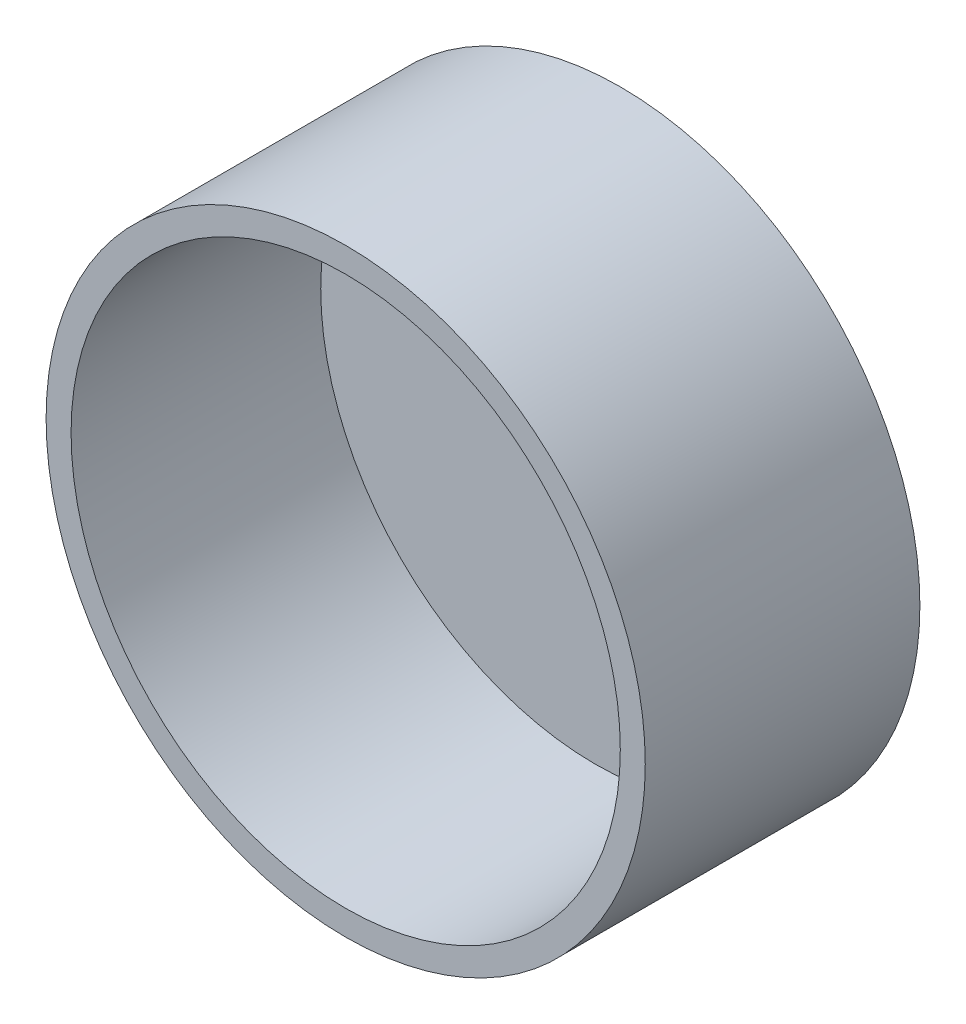
ISO-10303-21;
HEADER;
FILE_DESCRIPTION(('STEP AP214'),'2;1');
FILE_NAME('part.step','',(''),(''),'','','');
FILE_SCHEMA(('AUTOMOTIVE_DESIGN { 1 0 10303 214 1 1 1 1 }'));
ENDSEC;
DATA;
#1=APPLICATION_CONTEXT('core data for automotive mechanical design processes');
#2=APPLICATION_PROTOCOL_DEFINITION('international standard','automotive_design',2000,#1);
#3=PRODUCT_CONTEXT('',#1,'mechanical');
#4=PRODUCT('Part','Part','',(#3));
#5=PRODUCT_RELATED_PRODUCT_CATEGORY('part','',(#4));
#6=PRODUCT_DEFINITION_FORMATION('','',#4);
#7=PRODUCT_DEFINITION_CONTEXT('part definition',#1,'design');
#8=PRODUCT_DEFINITION('design','',#6,#7);
#9=PRODUCT_DEFINITION_SHAPE('','',#8);
#10=(LENGTH_UNIT() NAMED_UNIT(*) SI_UNIT(.MILLI.,.METRE.));
#11=(NAMED_UNIT(*) PLANE_ANGLE_UNIT() SI_UNIT($,.RADIAN.));
#12=(NAMED_UNIT(*) SI_UNIT($,.STERADIAN.) SOLID_ANGLE_UNIT());
#13=UNCERTAINTY_MEASURE_WITH_UNIT(LENGTH_MEASURE(1.E-05),#10,'distance_accuracy_value','');
#14=(GEOMETRIC_REPRESENTATION_CONTEXT(3) GLOBAL_UNCERTAINTY_ASSIGNED_CONTEXT((#13)) GLOBAL_UNIT_ASSIGNED_CONTEXT((#10,
#11,#12)) REPRESENTATION_CONTEXT('',''));
#15=CARTESIAN_POINT('',(0.,0.,0.));
#16=DIRECTION('',(0.,0.,1.));
#17=DIRECTION('',(1.,0.,0.));
#18=AXIS2_PLACEMENT_3D('',#15,#16,#17);
#19=CARTESIAN_POINT('',(0.,0.,25.4));
#20=DIRECTION('',(0.,0.,-1.));
#21=DIRECTION('',(-1.,0.,0.));
#22=AXIS2_PLACEMENT_3D('',#19,#20,#21);
#23=CYLINDRICAL_SURFACE('',#22,30.48);
#24=CARTESIAN_POINT('',(0.,0.,25.4));
#25=DIRECTION('',(0.,0.,1.));
#26=DIRECTION('',(1.,0.,0.));
#27=AXIS2_PLACEMENT_3D('',#24,#25,#26);
#28=CIRCLE('',#27,30.48);
#29=CARTESIAN_POINT('',(-30.48,0.,25.4));
#30=VERTEX_POINT('',#29);
#31=EDGE_CURVE('E10',#30,#30,#28,.T.);
#32=CARTESIAN_POINT('',(0.,0.,-2.54));
#33=DIRECTION('',(0.,0.,1.));
#34=DIRECTION('',(1.,0.,0.));
#35=AXIS2_PLACEMENT_3D('',#32,#33,#34);
#36=CIRCLE('',#35,30.48);
#37=CARTESIAN_POINT('',(-30.48,0.,-2.54));
#38=VERTEX_POINT('',#37);
#39=EDGE_CURVE('E45',#38,#38,#36,.T.);
#40=CARTESIAN_POINT('',(-30.48,0.,25.4));
#41=CARTESIAN_POINT('',(-30.48,0.,25.1089583333333));
#42=CARTESIAN_POINT('',(-30.48,0.,24.8179166666667));
#43=CARTESIAN_POINT('',(-30.48,0.,24.2358333333333));
#44=CARTESIAN_POINT('',(-30.48,0.,23.9447916666667));
#45=CARTESIAN_POINT('',(-30.48,0.,23.3627083333333));
#46=CARTESIAN_POINT('',(-30.48,0.,23.0716666666667));
#47=CARTESIAN_POINT('',(-30.48,0.,22.4895833333333));
#48=CARTESIAN_POINT('',(-30.48,0.,22.1985416666667));
#49=CARTESIAN_POINT('',(-30.48,0.,21.6164583333333));
#50=CARTESIAN_POINT('',(-30.48,0.,21.3254166666667));
#51=CARTESIAN_POINT('',(-30.48,0.,20.7433333333333));
#52=CARTESIAN_POINT('',(-30.48,0.,20.4522916666667));
#53=CARTESIAN_POINT('',(-30.48,0.,19.8702083333333));
#54=CARTESIAN_POINT('',(-30.48,0.,19.5791666666667));
#55=CARTESIAN_POINT('',(-30.48,0.,18.9970833333333));
#56=CARTESIAN_POINT('',(-30.48,0.,18.7060416666667));
#57=CARTESIAN_POINT('',(-30.48,0.,18.1239583333333));
#58=CARTESIAN_POINT('',(-30.48,0.,17.8329166666667));
#59=CARTESIAN_POINT('',(-30.48,0.,17.2508333333333));
#60=CARTESIAN_POINT('',(-30.48,0.,16.9597916666667));
#61=CARTESIAN_POINT('',(-30.48,0.,16.3777083333333));
#62=CARTESIAN_POINT('',(-30.48,0.,16.0866666666667));
#63=CARTESIAN_POINT('',(-30.48,0.,15.5045833333333));
#64=CARTESIAN_POINT('',(-30.48,0.,15.2135416666667));
#65=CARTESIAN_POINT('',(-30.48,0.,14.6314583333333));
#66=CARTESIAN_POINT('',(-30.48,0.,14.3404166666667));
#67=CARTESIAN_POINT('',(-30.48,0.,13.7583333333333));
#68=CARTESIAN_POINT('',(-30.48,0.,13.4672916666667));
#69=CARTESIAN_POINT('',(-30.48,0.,12.8852083333333));
#70=CARTESIAN_POINT('',(-30.48,0.,12.5941666666667));
#71=CARTESIAN_POINT('',(-30.48,0.,12.0120833333333));
#72=CARTESIAN_POINT('',(-30.48,0.,11.7210416666667));
#73=CARTESIAN_POINT('',(-30.48,0.,11.1389583333333));
#74=CARTESIAN_POINT('',(-30.48,0.,10.8479166666667));
#75=CARTESIAN_POINT('',(-30.48,0.,10.2658333333333));
#76=CARTESIAN_POINT('',(-30.48,0.,9.97479166666667));
#77=CARTESIAN_POINT('',(-30.48,0.,9.39270833333333));
#78=CARTESIAN_POINT('',(-30.48,0.,9.10166666666667));
#79=CARTESIAN_POINT('',(-30.48,0.,8.51958333333334));
#80=CARTESIAN_POINT('',(-30.48,0.,8.22854166666667));
#81=CARTESIAN_POINT('',(-30.48,0.,7.64645833333333));
#82=CARTESIAN_POINT('',(-30.48,0.,7.35541666666667));
#83=CARTESIAN_POINT('',(-30.48,0.,6.77333333333334));
#84=CARTESIAN_POINT('',(-30.48,0.,6.48229166666667));
#85=CARTESIAN_POINT('',(-30.48,0.,5.90020833333333));
#86=CARTESIAN_POINT('',(-30.48,0.,5.60916666666667));
#87=CARTESIAN_POINT('',(-30.48,0.,5.02708333333333));
#88=CARTESIAN_POINT('',(-30.48,0.,4.73604166666667));
#89=CARTESIAN_POINT('',(-30.48,0.,4.15395833333334));
#90=CARTESIAN_POINT('',(-30.48,0.,3.86291666666667));
#91=CARTESIAN_POINT('',(-30.48,0.,3.28083333333333));
#92=CARTESIAN_POINT('',(-30.48,0.,2.98979166666667));
#93=CARTESIAN_POINT('',(-30.48,0.,2.40770833333333));
#94=CARTESIAN_POINT('',(-30.48,0.,2.11666666666667));
#95=CARTESIAN_POINT('',(-30.48,0.,1.53458333333333));
#96=CARTESIAN_POINT('',(-30.48,0.,1.24354166666667));
#97=CARTESIAN_POINT('',(-30.48,0.,0.661458333333334));
#98=CARTESIAN_POINT('',(-30.48,0.,0.370416666666667));
#99=CARTESIAN_POINT('',(-30.48,0.,-0.211666666666667));
#100=CARTESIAN_POINT('',(-30.48,0.,-0.502708333333333));
#101=CARTESIAN_POINT('',(-30.48,0.,-1.08479166666667));
#102=CARTESIAN_POINT('',(-30.48,0.,-1.37583333333333));
#103=CARTESIAN_POINT('',(-30.48,0.,-1.95791666666667));
#104=CARTESIAN_POINT('',(-30.48,0.,-2.24895833333333));
#105=CARTESIAN_POINT('',(-30.48,0.,-2.54));
#106=B_SPLINE_CURVE_WITH_KNOTS('',3,(#40,#41,#42,#43,#44,#45,#46,#47,#48,#49,#50,#51,#52,#53,
#54,#55,#56,#57,#58,#59,#60,#61,#62,#63,#64,#65,#66,#67,#68,#69,#70,#71,#72,#73,#74,#75,#76,#77,
#78,#79,#80,#81,#82,#83,#84,#85,#86,#87,#88,#89,#90,#91,#92,#93,#94,#95,#96,#97,#98,#99,#100,
#101,#102,#103,#104,#105),.UNSPECIFIED.,.F.,.F.,(4,2,2,2,2,2,2,2,2,2,2,2,2,2,2,2,2,2,2,2,2,2,2,
2,2,2,2,2,2,2,2,2,4),(0.,0.873125000000002,1.74625,2.619375,3.4925,4.365625,5.23875,6.111875,
6.985,7.858125,8.73125,9.604375,10.4775,11.350625,12.22375,13.096875,13.97,14.843125,15.71625,
16.589375,17.4625,18.335625,19.20875,20.081875,20.955,21.828125,22.70125,23.574375,24.4475,
25.320625,26.19375,27.066875,27.94),.UNSPECIFIED.);
#107=EDGE_CURVE('BSEAM37',#30,#38,#106,.T.);
#108=ORIENTED_EDGE('',*,*,#31,.F.);
#109=ORIENTED_EDGE('',*,*,#39,.T.);
#110=ORIENTED_EDGE('',*,*,#107,.T.);
#111=ORIENTED_EDGE('',*,*,#107,.F.);
#112=EDGE_LOOP('',(#108,#110,#109,#111));
#113=FACE_BOUND('',#112,.T.);
#114=ADVANCED_FACE('F37',(#113),#23,.T.);
#115=CARTESIAN_POINT('',(0.,0.,25.4));
#116=DIRECTION('',(0.,0.,1.));
#117=DIRECTION('',(1.,0.,0.));
#118=AXIS2_PLACEMENT_3D('',#115,#116,#117);
#119=PLANE('',#118);
#120=CARTESIAN_POINT('',(0.,0.,25.4));
#121=DIRECTION('',(0.,0.,1.));
#122=DIRECTION('',(1.,0.,0.));
#123=AXIS2_PLACEMENT_3D('',#120,#121,#122);
#124=CIRCLE('',#123,27.94);
#125=CARTESIAN_POINT('',(-27.94,0.,25.4));
#126=VERTEX_POINT('',#125);
#127=EDGE_CURVE('E50',#126,#126,#124,.T.);
#128=ORIENTED_EDGE('',*,*,#127,.F.);
#129=EDGE_LOOP('',(#128));
#130=FACE_BOUND('',#129,.T.);
#131=ORIENTED_EDGE('',*,*,#31,.T.);
#132=EDGE_LOOP('',(#131));
#133=FACE_BOUND('',#132,.T.);
#134=ADVANCED_FACE('F73',(#130,#133),#119,.T.);
#135=CARTESIAN_POINT('',(0.,0.,-2.54));
#136=DIRECTION('',(0.,0.,1.));
#137=DIRECTION('',(1.,0.,0.));
#138=AXIS2_PLACEMENT_3D('',#135,#136,#137);
#139=PLANE('',#138);
#140=ORIENTED_EDGE('',*,*,#39,.F.);
#141=EDGE_LOOP('',(#140));
#142=FACE_BOUND('',#141,.T.);
#143=ADVANCED_FACE('F39',(#142),#139,.F.);
#144=CARTESIAN_POINT('',(0.,0.,25.4));
#145=DIRECTION('',(0.,0.,-1.));
#146=DIRECTION('',(-1.,0.,0.));
#147=AXIS2_PLACEMENT_3D('',#144,#145,#146);
#148=CYLINDRICAL_SURFACE('',#147,27.94);
#149=CARTESIAN_POINT('',(0.,0.,0.));
#150=DIRECTION('',(0.,0.,1.));
#151=DIRECTION('',(1.,0.,0.));
#152=AXIS2_PLACEMENT_3D('',#149,#150,#151);
#153=CIRCLE('',#152,27.94);
#154=CARTESIAN_POINT('',(-27.94,0.,0.));
#155=VERTEX_POINT('',#154);
#156=EDGE_CURVE('E55',#155,#155,#153,.T.);
#157=CARTESIAN_POINT('',(-27.94,0.,25.4));
#158=CARTESIAN_POINT('',(-27.94,0.,25.1354166666667));
#159=CARTESIAN_POINT('',(-27.94,0.,24.8708333333333));
#160=CARTESIAN_POINT('',(-27.94,0.,24.3416666666667));
#161=CARTESIAN_POINT('',(-27.94,0.,24.0770833333333));
#162=CARTESIAN_POINT('',(-27.94,0.,23.5479166666667));
#163=CARTESIAN_POINT('',(-27.94,0.,23.2833333333333));
#164=CARTESIAN_POINT('',(-27.94,0.,22.7541666666667));
#165=CARTESIAN_POINT('',(-27.94,0.,22.4895833333333));
#166=CARTESIAN_POINT('',(-27.94,0.,21.9604166666667));
#167=CARTESIAN_POINT('',(-27.94,0.,21.6958333333333));
#168=CARTESIAN_POINT('',(-27.94,0.,21.1666666666667));
#169=CARTESIAN_POINT('',(-27.94,0.,20.9020833333333));
#170=CARTESIAN_POINT('',(-27.94,0.,20.3729166666667));
#171=CARTESIAN_POINT('',(-27.94,0.,20.1083333333333));
#172=CARTESIAN_POINT('',(-27.94,0.,19.5791666666667));
#173=CARTESIAN_POINT('',(-27.94,0.,19.3145833333333));
#174=CARTESIAN_POINT('',(-27.94,0.,18.7854166666667));
#175=CARTESIAN_POINT('',(-27.94,0.,18.5208333333333));
#176=CARTESIAN_POINT('',(-27.94,0.,17.9916666666667));
#177=CARTESIAN_POINT('',(-27.94,0.,17.7270833333333));
#178=CARTESIAN_POINT('',(-27.94,0.,17.1979166666667));
#179=CARTESIAN_POINT('',(-27.94,0.,16.9333333333333));
#180=CARTESIAN_POINT('',(-27.94,0.,16.4041666666667));
#181=CARTESIAN_POINT('',(-27.94,0.,16.1395833333333));
#182=CARTESIAN_POINT('',(-27.94,0.,15.6104166666667));
#183=CARTESIAN_POINT('',(-27.94,0.,15.3458333333333));
#184=CARTESIAN_POINT('',(-27.94,0.,14.8166666666667));
#185=CARTESIAN_POINT('',(-27.94,0.,14.5520833333333));
#186=CARTESIAN_POINT('',(-27.94,0.,14.0229166666667));
#187=CARTESIAN_POINT('',(-27.94,0.,13.7583333333333));
#188=CARTESIAN_POINT('',(-27.94,0.,13.2291666666667));
#189=CARTESIAN_POINT('',(-27.94,0.,12.9645833333333));
#190=CARTESIAN_POINT('',(-27.94,0.,12.4354166666667));
#191=CARTESIAN_POINT('',(-27.94,0.,12.1708333333333));
#192=CARTESIAN_POINT('',(-27.94,0.,11.6416666666667));
#193=CARTESIAN_POINT('',(-27.94,0.,11.3770833333333));
#194=CARTESIAN_POINT('',(-27.94,0.,10.8479166666667));
#195=CARTESIAN_POINT('',(-27.94,0.,10.5833333333333));
#196=CARTESIAN_POINT('',(-27.94,0.,10.0541666666667));
#197=CARTESIAN_POINT('',(-27.94,0.,9.78958333333333));
#198=CARTESIAN_POINT('',(-27.94,0.,9.26041666666667));
#199=CARTESIAN_POINT('',(-27.94,0.,8.99583333333334));
#200=CARTESIAN_POINT('',(-27.94,0.,8.46666666666667));
#201=CARTESIAN_POINT('',(-27.94,0.,8.20208333333333));
#202=CARTESIAN_POINT('',(-27.94,0.,7.67291666666667));
#203=CARTESIAN_POINT('',(-27.94,0.,7.40833333333333));
#204=CARTESIAN_POINT('',(-27.94,0.,6.87916666666667));
#205=CARTESIAN_POINT('',(-27.94,0.,6.61458333333333));
#206=CARTESIAN_POINT('',(-27.94,0.,6.08541666666667));
#207=CARTESIAN_POINT('',(-27.94,0.,5.82083333333333));
#208=CARTESIAN_POINT('',(-27.94,0.,5.29166666666667));
#209=CARTESIAN_POINT('',(-27.94,0.,5.02708333333334));
#210=CARTESIAN_POINT('',(-27.94,0.,4.49791666666667));
#211=CARTESIAN_POINT('',(-27.94,0.,4.23333333333333));
#212=CARTESIAN_POINT('',(-27.94,0.,3.70416666666667));
#213=CARTESIAN_POINT('',(-27.94,0.,3.43958333333333));
#214=CARTESIAN_POINT('',(-27.94,0.,2.91041666666667));
#215=CARTESIAN_POINT('',(-27.94,0.,2.64583333333333));
#216=CARTESIAN_POINT('',(-27.94,0.,2.11666666666667));
#217=CARTESIAN_POINT('',(-27.94,0.,1.85208333333333));
#218=CARTESIAN_POINT('',(-27.94,0.,1.32291666666667));
#219=CARTESIAN_POINT('',(-27.94,0.,1.05833333333333));
#220=CARTESIAN_POINT('',(-27.94,0.,0.529166666666666));
#221=CARTESIAN_POINT('',(-27.94,0.,0.264583333333333));
#222=CARTESIAN_POINT('',(-27.94,0.,0.));
#223=B_SPLINE_CURVE_WITH_KNOTS('',3,(#157,#158,#159,#160,#161,#162,#163,#164,#165,#166,#167,
#168,#169,#170,#171,#172,#173,#174,#175,#176,#177,#178,#179,#180,#181,#182,#183,#184,#185,#186,
#187,#188,#189,#190,#191,#192,#193,#194,#195,#196,#197,#198,#199,#200,#201,#202,#203,#204,#205,
#206,#207,#208,#209,#210,#211,#212,#213,#214,#215,#216,#217,#218,#219,#220,#221,#222),
.UNSPECIFIED.,.F.,.F.,(4,2,2,2,2,2,2,2,2,2,2,2,2,2,2,2,2,2,2,2,2,2,2,2,2,2,2,2,2,2,2,2,4),(0.,
0.793750000000003,1.5875,2.38125,3.175,3.96875,4.7625,5.55625,6.35,7.14375,7.9375,8.73125,9.525,
10.31875,11.1125,11.90625,12.7,13.49375,14.2875,15.08125,15.875,16.66875,17.4625,18.25625,19.05,
19.84375,20.6375,21.43125,22.225,23.01875,23.8125,24.60625,25.4),.UNSPECIFIED.);
#224=EDGE_CURVE('BSEAM64',#126,#155,#223,.T.);
#225=ORIENTED_EDGE('',*,*,#127,.T.);
#226=ORIENTED_EDGE('',*,*,#156,.F.);
#227=ORIENTED_EDGE('',*,*,#224,.T.);
#228=ORIENTED_EDGE('',*,*,#224,.F.);
#229=EDGE_LOOP('',(#225,#227,#226,#228));
#230=FACE_BOUND('',#229,.T.);
#231=ADVANCED_FACE('F64',(#230),#148,.F.);
#232=CARTESIAN_POINT('',(0.,0.,0.));
#233=DIRECTION('',(0.,0.,1.));
#234=DIRECTION('',(1.,0.,0.));
#235=AXIS2_PLACEMENT_3D('',#232,#233,#234);
#236=PLANE('',#235);
#237=ORIENTED_EDGE('',*,*,#156,.T.);
#238=EDGE_LOOP('',(#237));
#239=FACE_BOUND('',#238,.T.);
#240=ADVANCED_FACE('F62',(#239),#236,.T.);
#241=CLOSED_SHELL('',(#114,#134,#143,#231,#240));
#242=MANIFOLD_SOLID_BREP('B2',#241);
#243=ADVANCED_BREP_SHAPE_REPRESENTATION('',(#18,#242),#14);
#244=SHAPE_DEFINITION_REPRESENTATION(#9,#243);
ENDSEC;
END-ISO-10303-21;
